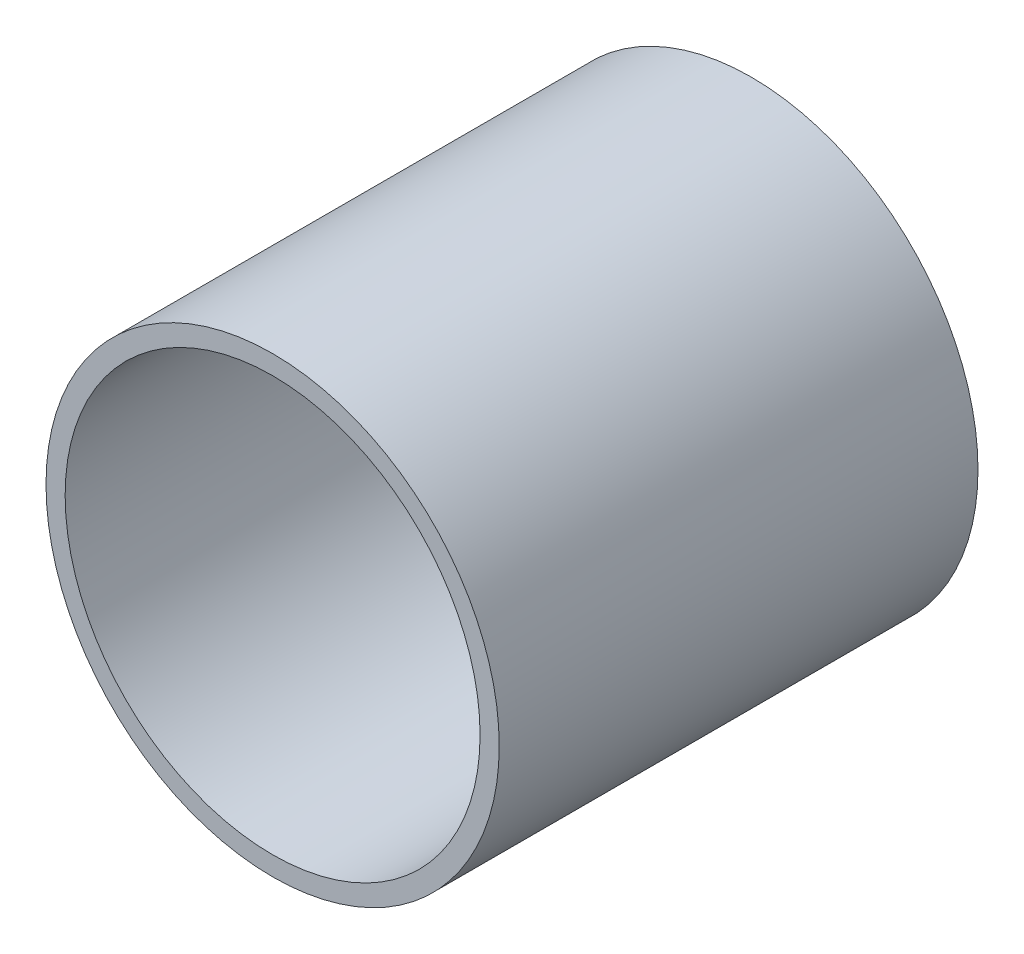
ISO-10303-21;
HEADER;
FILE_DESCRIPTION(('STEP AP214'),'2;1');
FILE_NAME('part.step','',(''),(''),'','','');
FILE_SCHEMA(('AUTOMOTIVE_DESIGN { 1 0 10303 214 1 1 1 1 }'));
ENDSEC;
DATA;
#1=APPLICATION_CONTEXT('core data for automotive mechanical design processes');
#2=APPLICATION_PROTOCOL_DEFINITION('international standard','automotive_design',2000,#1);
#3=PRODUCT_CONTEXT('',#1,'mechanical');
#4=PRODUCT('Part','Part','',(#3));
#5=PRODUCT_RELATED_PRODUCT_CATEGORY('part','',(#4));
#6=PRODUCT_DEFINITION_FORMATION('','',#4);
#7=PRODUCT_DEFINITION_CONTEXT('part definition',#1,'design');
#8=PRODUCT_DEFINITION('design','',#6,#7);
#9=PRODUCT_DEFINITION_SHAPE('','',#8);
#10=(LENGTH_UNIT() NAMED_UNIT(*) SI_UNIT(.MILLI.,.METRE.));
#11=(NAMED_UNIT(*) PLANE_ANGLE_UNIT() SI_UNIT($,.RADIAN.));
#12=(NAMED_UNIT(*) SI_UNIT($,.STERADIAN.) SOLID_ANGLE_UNIT());
#13=UNCERTAINTY_MEASURE_WITH_UNIT(LENGTH_MEASURE(1.E-05),#10,'distance_accuracy_value','');
#14=(GEOMETRIC_REPRESENTATION_CONTEXT(3) GLOBAL_UNCERTAINTY_ASSIGNED_CONTEXT((#13)) GLOBAL_UNIT_ASSIGNED_CONTEXT((#10,
#11,#12)) REPRESENTATION_CONTEXT('',''));
#15=CARTESIAN_POINT('',(0.,0.,0.));
#16=DIRECTION('',(0.,0.,1.));
#17=DIRECTION('',(1.,0.,0.));
#18=AXIS2_PLACEMENT_3D('',#15,#16,#17);
#19=CARTESIAN_POINT('',(0.,0.,75.));
#20=DIRECTION('',(0.,0.,1.));
#21=DIRECTION('',(1.,0.,0.));
#22=AXIS2_PLACEMENT_3D('',#19,#20,#21);
#23=PLANE('',#22);
#24=CARTESIAN_POINT('',(0.,0.,75.));
#25=DIRECTION('',(0.,0.,1.));
#26=DIRECTION('',(1.,0.,0.));
#27=AXIS2_PLACEMENT_3D('',#24,#25,#26);
#28=CIRCLE('',#27,35.5);
#29=CARTESIAN_POINT('',(35.5,0.,75.));
#30=VERTEX_POINT('',#29);
#31=EDGE_CURVE('E10',#30,#30,#28,.T.);
#32=ORIENTED_EDGE('',*,*,#31,.T.);
#33=EDGE_LOOP('',(#32));
#34=FACE_BOUND('',#33,.T.);
#35=CARTESIAN_POINT('',(0.,0.,75.));
#36=DIRECTION('',(0.,0.,1.));
#37=DIRECTION('',(1.,0.,0.));
#38=AXIS2_PLACEMENT_3D('',#35,#36,#37);
#39=CIRCLE('',#38,32.5);
#40=CARTESIAN_POINT('',(32.5,0.,75.));
#41=VERTEX_POINT('',#40);
#42=EDGE_CURVE('E44',#41,#41,#39,.T.);
#43=ORIENTED_EDGE('',*,*,#42,.F.);
#44=EDGE_LOOP('',(#43));
#45=FACE_BOUND('',#44,.T.);
#46=ADVANCED_FACE('F33',(#34,#45),#23,.T.);
#47=CARTESIAN_POINT('',(0.,0.,0.));
#48=DIRECTION('',(0.,0.,1.));
#49=DIRECTION('',(1.,0.,0.));
#50=AXIS2_PLACEMENT_3D('',#47,#48,#49);
#51=PLANE('',#50);
#52=CARTESIAN_POINT('',(0.,0.,0.));
#53=DIRECTION('',(0.,0.,1.));
#54=DIRECTION('',(1.,0.,0.));
#55=AXIS2_PLACEMENT_3D('',#52,#53,#54);
#56=CIRCLE('',#55,35.5);
#57=CARTESIAN_POINT('',(35.5,0.,0.));
#58=VERTEX_POINT('',#57);
#59=EDGE_CURVE('E37',#58,#58,#56,.T.);
#60=ORIENTED_EDGE('',*,*,#59,.F.);
#61=EDGE_LOOP('',(#60));
#62=FACE_BOUND('',#61,.T.);
#63=CARTESIAN_POINT('',(0.,0.,0.));
#64=DIRECTION('',(0.,0.,1.));
#65=DIRECTION('',(1.,0.,0.));
#66=AXIS2_PLACEMENT_3D('',#63,#64,#65);
#67=CIRCLE('',#66,32.5);
#68=CARTESIAN_POINT('',(32.5,0.,0.));
#69=VERTEX_POINT('',#68);
#70=EDGE_CURVE('E46',#69,#69,#67,.T.);
#71=ORIENTED_EDGE('',*,*,#70,.T.);
#72=EDGE_LOOP('',(#71));
#73=FACE_BOUND('',#72,.T.);
#74=ADVANCED_FACE('F56',(#62,#73),#51,.F.);
#75=CARTESIAN_POINT('',(0.,0.,75.));
#76=DIRECTION('',(0.,0.,-1.));
#77=DIRECTION('',(-1.,0.,0.));
#78=AXIS2_PLACEMENT_3D('',#75,#76,#77);
#79=CYLINDRICAL_SURFACE('',#78,35.5);
#80=ORIENTED_EDGE('',*,*,#31,.F.);
#81=EDGE_LOOP('',(#80));
#82=FACE_BOUND('',#81,.T.);
#83=ORIENTED_EDGE('',*,*,#59,.T.);
#84=EDGE_LOOP('',(#83));
#85=FACE_BOUND('',#84,.T.);
#86=ADVANCED_FACE('F35',(#82,#85),#79,.T.);
#87=CARTESIAN_POINT('',(0.,0.,75.));
#88=DIRECTION('',(0.,0.,-1.));
#89=DIRECTION('',(-1.,0.,0.));
#90=AXIS2_PLACEMENT_3D('',#87,#88,#89);
#91=CYLINDRICAL_SURFACE('',#90,32.5);
#92=ORIENTED_EDGE('',*,*,#42,.T.);
#93=EDGE_LOOP('',(#92));
#94=FACE_BOUND('',#93,.T.);
#95=ORIENTED_EDGE('',*,*,#70,.F.);
#96=EDGE_LOOP('',(#95));
#97=FACE_BOUND('',#96,.T.);
#98=ADVANCED_FACE('F52',(#94,#97),#91,.F.);
#99=CLOSED_SHELL('',(#46,#74,#86,#98));
#100=MANIFOLD_SOLID_BREP('B2',#99);
#101=ADVANCED_BREP_SHAPE_REPRESENTATION('',(#18,#100),#14);
#102=SHAPE_DEFINITION_REPRESENTATION(#9,#101);
ENDSEC;
END-ISO-10303-21;
